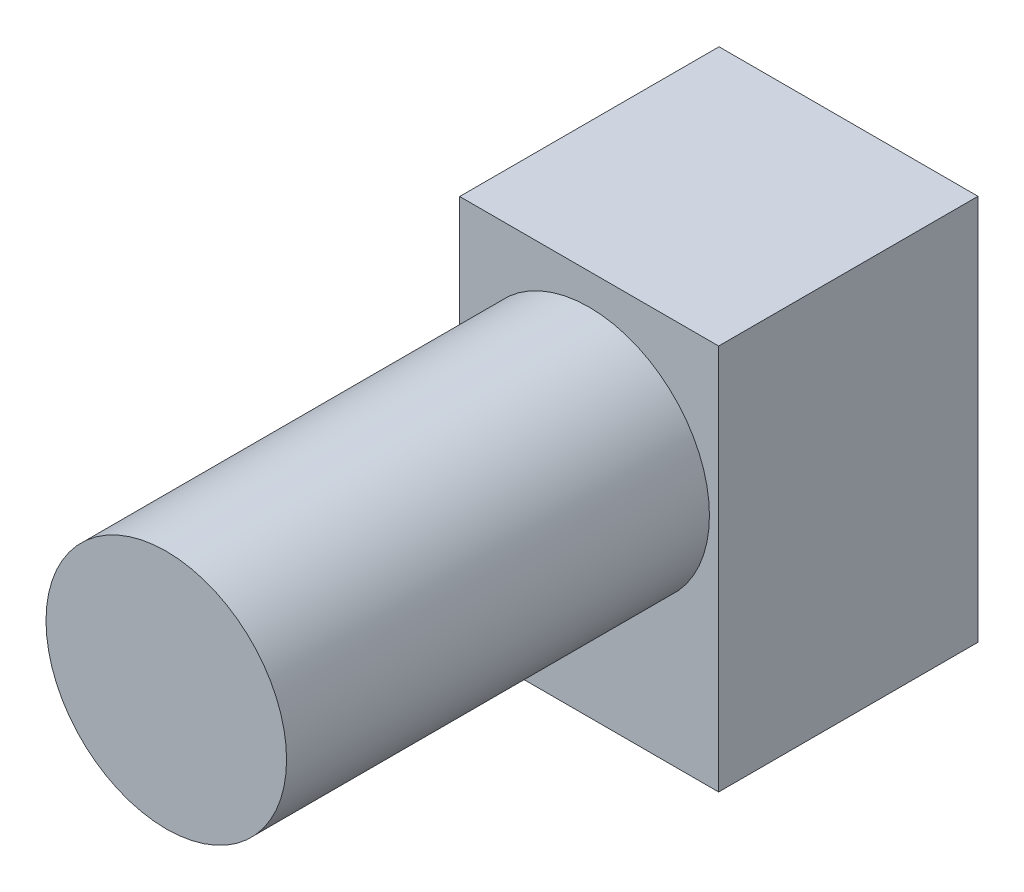
ISO-10303-21;
HEADER;
FILE_DESCRIPTION(('STEP AP214'),'2;1');
FILE_NAME('part.step','',(''),(''),'','','');
FILE_SCHEMA(('AUTOMOTIVE_DESIGN { 1 0 10303 214 1 1 1 1 }'));
ENDSEC;
DATA;
#1=APPLICATION_CONTEXT('core data for automotive mechanical design processes');
#2=APPLICATION_PROTOCOL_DEFINITION('international standard','automotive_design',2000,#1);
#3=PRODUCT_CONTEXT('',#1,'mechanical');
#4=PRODUCT('Part','Part','',(#3));
#5=PRODUCT_RELATED_PRODUCT_CATEGORY('part','',(#4));
#6=PRODUCT_DEFINITION_FORMATION('','',#4);
#7=PRODUCT_DEFINITION_CONTEXT('part definition',#1,'design');
#8=PRODUCT_DEFINITION('design','',#6,#7);
#9=PRODUCT_DEFINITION_SHAPE('','',#8);
#10=(LENGTH_UNIT() NAMED_UNIT(*) SI_UNIT(.MILLI.,.METRE.));
#11=(NAMED_UNIT(*) PLANE_ANGLE_UNIT() SI_UNIT($,.RADIAN.));
#12=(NAMED_UNIT(*) SI_UNIT($,.STERADIAN.) SOLID_ANGLE_UNIT());
#13=UNCERTAINTY_MEASURE_WITH_UNIT(LENGTH_MEASURE(1.E-05),#10,'distance_accuracy_value','');
#14=(GEOMETRIC_REPRESENTATION_CONTEXT(3) GLOBAL_UNCERTAINTY_ASSIGNED_CONTEXT((#13)) GLOBAL_UNIT_ASSIGNED_CONTEXT((#10,
#11,#12)) REPRESENTATION_CONTEXT('',''));
#15=CARTESIAN_POINT('',(0.,0.,0.));
#16=DIRECTION('',(0.,0.,1.));
#17=DIRECTION('',(1.,0.,0.));
#18=AXIS2_PLACEMENT_3D('',#15,#16,#17);
#19=CARTESIAN_POINT('',(3.50000000000001,5.22000000000002,7.0104));
#20=DIRECTION('',(0.,0.,-1.));
#21=DIRECTION('',(-1.,0.,0.));
#22=AXIS2_PLACEMENT_3D('',#19,#20,#21);
#23=PLANE('',#22);
#24=DIRECTION('',(0.,1.,0.));
#25=VECTOR('',#24,1.);
#26=CARTESIAN_POINT('',(3.50000000000001,-5.21999999999997,7.0104));
#27=LINE('',#26,#25);
#28=CARTESIAN_POINT('',(3.50000000000001,-5.21999999999997,7.0104));
#29=VERTEX_POINT('',#28);
#30=CARTESIAN_POINT('',(3.50000000000001,5.22000000000002,7.0104));
#31=VERTEX_POINT('',#30);
#32=EDGE_CURVE('E84',#29,#31,#27,.T.);
#33=ORIENTED_EDGE('',*,*,#32,.T.);
#34=DIRECTION('',(-1.,0.,0.));
#35=VECTOR('',#34,1.);
#36=CARTESIAN_POINT('',(-3.49999999999999,5.22000000000002,7.0104));
#37=LINE('',#36,#35);
#38=CARTESIAN_POINT('',(-3.49999999999999,5.22000000000002,7.0104));
#39=VERTEX_POINT('',#38);
#40=EDGE_CURVE('E79',#31,#39,#37,.T.);
#41=ORIENTED_EDGE('',*,*,#40,.T.);
#42=DIRECTION('',(0.,-1.,0.));
#43=VECTOR('',#42,1.);
#44=CARTESIAN_POINT('',(-3.49999999999999,-5.21999999999997,7.0104));
#45=LINE('',#44,#43);
#46=CARTESIAN_POINT('',(-3.49999999999999,-5.21999999999997,7.0104));
#47=VERTEX_POINT('',#46);
#48=EDGE_CURVE('E82',#39,#47,#45,.T.);
#49=ORIENTED_EDGE('',*,*,#48,.T.);
#50=DIRECTION('',(1.,0.,0.));
#51=VECTOR('',#50,1.);
#52=CARTESIAN_POINT('',(-3.49999999999999,-5.21999999999997,7.0104));
#53=LINE('',#52,#51);
#54=EDGE_CURVE('E48',#47,#29,#53,.T.);
#55=ORIENTED_EDGE('',*,*,#54,.T.);
#56=EDGE_LOOP('',(#33,#41,#49,#55));
#57=FACE_BOUND('',#56,.T.);
#58=CARTESIAN_POINT('',(0.,1.13000000000002,7.0104));
#59=DIRECTION('',(0.,0.,-1.));
#60=DIRECTION('',(-1.,0.,0.));
#61=AXIS2_PLACEMENT_3D('',#58,#59,#60);
#62=CIRCLE('',#61,3.2512);
#63=CARTESIAN_POINT('',(-3.2512,1.13000000000002,7.0104));
#64=VERTEX_POINT('',#63);
#65=EDGE_CURVE('E11',#64,#64,#62,.F.);
#66=ORIENTED_EDGE('',*,*,#65,.F.);
#67=EDGE_LOOP('',(#66));
#68=FACE_BOUND('',#67,.T.);
#69=ADVANCED_FACE('F31',(#57,#68),#23,.F.);
#70=CARTESIAN_POINT('',(3.50000000000001,-5.21999999999997,7.0104));
#71=DIRECTION('',(-1.,0.,0.));
#72=DIRECTION('',(0.,0.,1.));
#73=AXIS2_PLACEMENT_3D('',#70,#71,#72);
#74=PLANE('',#73);
#75=DIRECTION('',(0.,1.,0.));
#76=VECTOR('',#75,1.);
#77=CARTESIAN_POINT('',(3.50000000000001,-5.21999999999997,0.));
#78=LINE('',#77,#76);
#79=CARTESIAN_POINT('',(3.50000000000001,-5.21999999999997,0.));
#80=VERTEX_POINT('',#79);
#81=CARTESIAN_POINT('',(3.50000000000001,5.22000000000002,0.));
#82=VERTEX_POINT('',#81);
#83=EDGE_CURVE('E98',#80,#82,#78,.T.);
#84=ORIENTED_EDGE('',*,*,#83,.T.);
#85=DIRECTION('',(0.,0.,-1.));
#86=VECTOR('',#85,1.);
#87=CARTESIAN_POINT('',(3.50000000000001,5.22000000000002,7.0104));
#88=LINE('',#87,#86);
#89=EDGE_CURVE('E40',#31,#82,#88,.T.);
#90=ORIENTED_EDGE('',*,*,#89,.F.);
#91=ORIENTED_EDGE('',*,*,#32,.F.);
#92=DIRECTION('',(0.,0.,-1.));
#93=VECTOR('',#92,1.);
#94=CARTESIAN_POINT('',(3.50000000000001,-5.21999999999997,7.0104));
#95=LINE('',#94,#93);
#96=EDGE_CURVE('E94',#29,#80,#95,.T.);
#97=ORIENTED_EDGE('',*,*,#96,.T.);
#98=EDGE_LOOP('',(#84,#90,#91,#97));
#99=FACE_BOUND('',#98,.T.);
#100=ADVANCED_FACE('F33',(#99),#74,.F.);
#101=CARTESIAN_POINT('',(-3.49999999999999,5.22000000000002,7.0104));
#102=DIRECTION('',(0.,-1.,0.));
#103=DIRECTION('',(0.,0.,-1.));
#104=AXIS2_PLACEMENT_3D('',#101,#102,#103);
#105=PLANE('',#104);
#106=DIRECTION('',(-1.,0.,0.));
#107=VECTOR('',#106,1.);
#108=CARTESIAN_POINT('',(-3.49999999999999,5.22000000000002,0.));
#109=LINE('',#108,#107);
#110=CARTESIAN_POINT('',(-3.49999999999999,5.22000000000002,0.));
#111=VERTEX_POINT('',#110);
#112=EDGE_CURVE('E89',#82,#111,#109,.T.);
#113=ORIENTED_EDGE('',*,*,#112,.T.);
#114=DIRECTION('',(0.,0.,-1.));
#115=VECTOR('',#114,1.);
#116=CARTESIAN_POINT('',(-3.49999999999999,5.22000000000002,7.0104));
#117=LINE('',#116,#115);
#118=EDGE_CURVE('E87',#39,#111,#117,.T.);
#119=ORIENTED_EDGE('',*,*,#118,.F.);
#120=ORIENTED_EDGE('',*,*,#40,.F.);
#121=ORIENTED_EDGE('',*,*,#89,.T.);
#122=EDGE_LOOP('',(#113,#119,#120,#121));
#123=FACE_BOUND('',#122,.T.);
#124=ADVANCED_FACE('F88',(#123),#105,.F.);
#125=CARTESIAN_POINT('',(-3.49999999999999,-5.21999999999997,7.0104));
#126=DIRECTION('',(1.,0.,0.));
#127=DIRECTION('',(0.,0.,-1.));
#128=AXIS2_PLACEMENT_3D('',#125,#126,#127);
#129=PLANE('',#128);
#130=DIRECTION('',(0.,-1.,0.));
#131=VECTOR('',#130,1.);
#132=CARTESIAN_POINT('',(-3.49999999999999,-5.21999999999997,0.));
#133=LINE('',#132,#131);
#134=CARTESIAN_POINT('',(-3.49999999999999,-5.21999999999997,0.));
#135=VERTEX_POINT('',#134);
#136=EDGE_CURVE('E65',#111,#135,#133,.T.);
#137=ORIENTED_EDGE('',*,*,#136,.T.);
#138=DIRECTION('',(0.,0.,-1.));
#139=VECTOR('',#138,1.);
#140=CARTESIAN_POINT('',(-3.49999999999999,-5.21999999999997,7.0104));
#141=LINE('',#140,#139);
#142=EDGE_CURVE('E90',#47,#135,#141,.T.);
#143=ORIENTED_EDGE('',*,*,#142,.F.);
#144=ORIENTED_EDGE('',*,*,#48,.F.);
#145=ORIENTED_EDGE('',*,*,#118,.T.);
#146=EDGE_LOOP('',(#137,#143,#144,#145));
#147=FACE_BOUND('',#146,.T.);
#148=ADVANCED_FACE('F92',(#147),#129,.F.);
#149=CARTESIAN_POINT('',(-3.49999999999999,-5.21999999999997,7.0104));
#150=DIRECTION('',(0.,1.,0.));
#151=DIRECTION('',(0.,0.,1.));
#152=AXIS2_PLACEMENT_3D('',#149,#150,#151);
#153=PLANE('',#152);
#154=DIRECTION('',(1.,0.,0.));
#155=VECTOR('',#154,1.);
#156=CARTESIAN_POINT('',(-3.49999999999999,-5.21999999999997,0.));
#157=LINE('',#156,#155);
#158=EDGE_CURVE('E71',#135,#80,#157,.T.);
#159=ORIENTED_EDGE('',*,*,#158,.T.);
#160=ORIENTED_EDGE('',*,*,#96,.F.);
#161=ORIENTED_EDGE('',*,*,#54,.F.);
#162=ORIENTED_EDGE('',*,*,#142,.T.);
#163=EDGE_LOOP('',(#159,#160,#161,#162));
#164=FACE_BOUND('',#163,.T.);
#165=ADVANCED_FACE('F112',(#164),#153,.F.);
#166=CARTESIAN_POINT('',(3.50000000000001,5.22000000000002,0.));
#167=DIRECTION('',(0.,0.,-1.));
#168=DIRECTION('',(-1.,0.,0.));
#169=AXIS2_PLACEMENT_3D('',#166,#167,#168);
#170=PLANE('',#169);
#171=ORIENTED_EDGE('',*,*,#83,.F.);
#172=ORIENTED_EDGE('',*,*,#158,.F.);
#173=ORIENTED_EDGE('',*,*,#136,.F.);
#174=ORIENTED_EDGE('',*,*,#112,.F.);
#175=EDGE_LOOP('',(#171,#172,#173,#174));
#176=FACE_BOUND('',#175,.T.);
#177=ADVANCED_FACE('F109',(#176),#170,.T.);
#178=CARTESIAN_POINT('',(0.,1.13000000000002,18.4404));
#179=DIRECTION('',(0.,0.,-1.));
#180=DIRECTION('',(-1.,0.,0.));
#181=AXIS2_PLACEMENT_3D('',#178,#179,#180);
#182=CYLINDRICAL_SURFACE('',#181,3.2512);
#183=CARTESIAN_POINT('',(0.,1.13000000000002,18.4404));
#184=DIRECTION('',(0.,0.,1.));
#185=DIRECTION('',(1.,0.,0.));
#186=AXIS2_PLACEMENT_3D('',#183,#184,#185);
#187=CIRCLE('',#186,3.2512);
#188=CARTESIAN_POINT('',(3.2512,1.13000000000002,18.4404));
#189=VERTEX_POINT('',#188);
#190=EDGE_CURVE('E101',#189,#189,#187,.T.);
#191=ORIENTED_EDGE('',*,*,#190,.F.);
#192=EDGE_LOOP('',(#191));
#193=FACE_BOUND('',#192,.T.);
#194=ORIENTED_EDGE('',*,*,#65,.T.);
#195=EDGE_LOOP('',(#194));
#196=FACE_BOUND('',#195,.T.);
#197=ADVANCED_FACE('F111',(#193,#196),#182,.T.);
#198=CARTESIAN_POINT('',(0.,1.13000000000002,18.4404));
#199=DIRECTION('',(0.,0.,1.));
#200=DIRECTION('',(1.,0.,0.));
#201=AXIS2_PLACEMENT_3D('',#198,#199,#200);
#202=PLANE('',#201);
#203=ORIENTED_EDGE('',*,*,#190,.T.);
#204=EDGE_LOOP('',(#203));
#205=FACE_BOUND('',#204,.T.);
#206=ADVANCED_FACE('F118',(#205),#202,.T.);
#207=CLOSED_SHELL('',(#69,#100,#124,#148,#165,#177,#197,#206));
#208=MANIFOLD_SOLID_BREP('B2',#207);
#209=ADVANCED_BREP_SHAPE_REPRESENTATION('',(#18,#208),#14);
#210=SHAPE_DEFINITION_REPRESENTATION(#9,#209);
ENDSEC;
END-ISO-10303-21;
